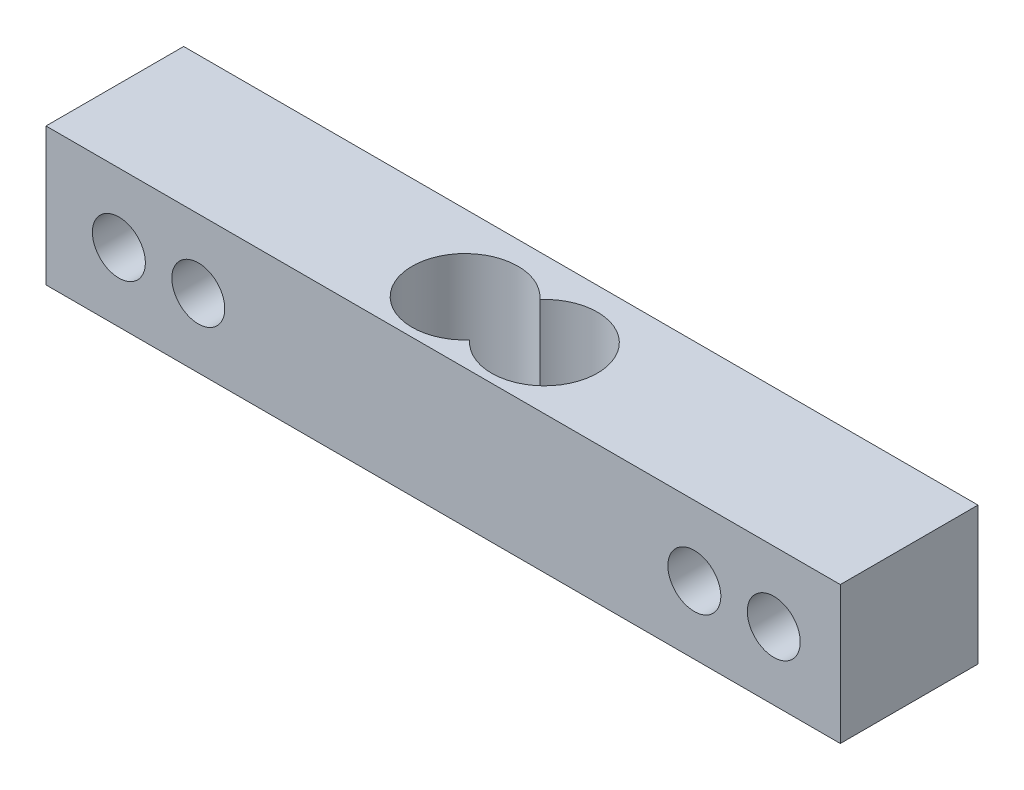
ISO-10303-21;
HEADER;
FILE_DESCRIPTION(('STEP AP214'),'2;1');
FILE_NAME('part.step','',(''),(''),'','','');
FILE_SCHEMA(('AUTOMOTIVE_DESIGN { 1 0 10303 214 1 1 1 1 }'));
ENDSEC;
DATA;
#1=APPLICATION_CONTEXT('core data for automotive mechanical design processes');
#2=APPLICATION_PROTOCOL_DEFINITION('international standard','automotive_design',2000,#1);
#3=PRODUCT_CONTEXT('',#1,'mechanical');
#4=PRODUCT('Part','Part','',(#3));
#5=PRODUCT_RELATED_PRODUCT_CATEGORY('part','',(#4));
#6=PRODUCT_DEFINITION_FORMATION('','',#4);
#7=PRODUCT_DEFINITION_CONTEXT('part definition',#1,'design');
#8=PRODUCT_DEFINITION('design','',#6,#7);
#9=PRODUCT_DEFINITION_SHAPE('','',#8);
#10=(LENGTH_UNIT() NAMED_UNIT(*) SI_UNIT(.MILLI.,.METRE.));
#11=(NAMED_UNIT(*) PLANE_ANGLE_UNIT() SI_UNIT($,.RADIAN.));
#12=(NAMED_UNIT(*) SI_UNIT($,.STERADIAN.) SOLID_ANGLE_UNIT());
#13=UNCERTAINTY_MEASURE_WITH_UNIT(LENGTH_MEASURE(1.E-05),#10,'distance_accuracy_value','');
#14=(GEOMETRIC_REPRESENTATION_CONTEXT(3) GLOBAL_UNCERTAINTY_ASSIGNED_CONTEXT((#13)) GLOBAL_UNIT_ASSIGNED_CONTEXT((#10,
#11,#12)) REPRESENTATION_CONTEXT('',''));
#15=CARTESIAN_POINT('',(0.,0.,0.));
#16=DIRECTION('',(0.,0.,1.));
#17=DIRECTION('',(1.,0.,0.));
#18=AXIS2_PLACEMENT_3D('',#15,#16,#17);
#19=CARTESIAN_POINT('',(-37.5,6.5,13.));
#20=DIRECTION('',(1.,0.,0.));
#21=DIRECTION('',(0.,0.,-1.));
#22=AXIS2_PLACEMENT_3D('',#19,#20,#21);
#23=PLANE('',#22);
#24=DIRECTION('',(0.,-1.,0.));
#25=VECTOR('',#24,1.);
#26=CARTESIAN_POINT('',(-37.5,6.5,0.));
#27=LINE('',#26,#25);
#28=CARTESIAN_POINT('',(-37.5,6.5,0.));
#29=VERTEX_POINT('',#28);
#30=CARTESIAN_POINT('',(-37.5,-6.5,0.));
#31=VERTEX_POINT('',#30);
#32=EDGE_CURVE('E110',#29,#31,#27,.T.);
#33=ORIENTED_EDGE('',*,*,#32,.T.);
#34=DIRECTION('',(0.,0.,-1.));
#35=VECTOR('',#34,1.);
#36=CARTESIAN_POINT('',(-37.5,-6.5,13.));
#37=LINE('',#36,#35);
#38=CARTESIAN_POINT('',(-37.5,-6.5,13.));
#39=VERTEX_POINT('',#38);
#40=EDGE_CURVE('E11',#39,#31,#37,.T.);
#41=ORIENTED_EDGE('',*,*,#40,.F.);
#42=DIRECTION('',(0.,-1.,0.));
#43=VECTOR('',#42,1.);
#44=CARTESIAN_POINT('',(-37.5,6.5,13.));
#45=LINE('',#44,#43);
#46=CARTESIAN_POINT('',(-37.5,6.5,13.));
#47=VERTEX_POINT('',#46);
#48=EDGE_CURVE('E127',#47,#39,#45,.T.);
#49=ORIENTED_EDGE('',*,*,#48,.F.);
#50=DIRECTION('',(0.,0.,-1.));
#51=VECTOR('',#50,1.);
#52=CARTESIAN_POINT('',(-37.5,6.5,13.));
#53=LINE('',#52,#51);
#54=EDGE_CURVE('E137',#47,#29,#53,.T.);
#55=ORIENTED_EDGE('',*,*,#54,.T.);
#56=EDGE_LOOP('',(#33,#41,#49,#55));
#57=FACE_BOUND('',#56,.T.);
#58=ADVANCED_FACE('F33',(#57),#23,.F.);
#59=CARTESIAN_POINT('',(37.5,-6.49999999999999,13.));
#60=DIRECTION('',(0.,1.,0.));
#61=DIRECTION('',(-1.,0.,0.));
#62=AXIS2_PLACEMENT_3D('',#59,#60,#61);
#63=PLANE('',#62);
#64=CARTESIAN_POINT('',(3.75,-6.5,7.18437662318027));
#65=DIRECTION('',(0.,1.,0.));
#66=DIRECTION('',(-1.,0.,0.));
#67=AXIS2_PLACEMENT_3D('',#64,#65,#66);
#68=CIRCLE('',#67,5.);
#69=CARTESIAN_POINT('',(0.,-6.5,10.491565762011));
#70=VERTEX_POINT('',#69);
#71=CARTESIAN_POINT('',(0.,-6.5,3.87718748434953));
#72=VERTEX_POINT('',#71);
#73=EDGE_CURVE('E88',#70,#72,#68,.T.);
#74=ORIENTED_EDGE('',*,*,#73,.T.);
#75=CARTESIAN_POINT('',(-3.75,-6.5,7.18437662318027));
#76=DIRECTION('',(0.,1.,0.));
#77=DIRECTION('',(-1.,0.,0.));
#78=AXIS2_PLACEMENT_3D('',#75,#76,#77);
#79=CIRCLE('',#78,5.);
#80=EDGE_CURVE('E47',#72,#70,#79,.T.);
#81=ORIENTED_EDGE('',*,*,#80,.T.);
#82=EDGE_LOOP('',(#74,#81));
#83=FACE_BOUND('',#82,.T.);
#84=DIRECTION('',(1.,0.,0.));
#85=VECTOR('',#84,1.);
#86=CARTESIAN_POINT('',(37.5,-6.49999999999999,0.));
#87=LINE('',#86,#85);
#88=CARTESIAN_POINT('',(37.5,-6.49999999999999,0.));
#89=VERTEX_POINT('',#88);
#90=EDGE_CURVE('E140',#31,#89,#87,.T.);
#91=ORIENTED_EDGE('',*,*,#90,.T.);
#92=DIRECTION('',(0.,0.,-1.));
#93=VECTOR('',#92,1.);
#94=CARTESIAN_POINT('',(37.5,-6.49999999999999,13.));
#95=LINE('',#94,#93);
#96=CARTESIAN_POINT('',(37.5,-6.49999999999999,13.));
#97=VERTEX_POINT('',#96);
#98=EDGE_CURVE('E40',#97,#89,#95,.T.);
#99=ORIENTED_EDGE('',*,*,#98,.F.);
#100=DIRECTION('',(1.,0.,0.));
#101=VECTOR('',#100,1.);
#102=CARTESIAN_POINT('',(37.5,-6.49999999999999,13.));
#103=LINE('',#102,#101);
#104=EDGE_CURVE('E130',#39,#97,#103,.T.);
#105=ORIENTED_EDGE('',*,*,#104,.F.);
#106=ORIENTED_EDGE('',*,*,#40,.T.);
#107=EDGE_LOOP('',(#91,#99,#105,#106));
#108=FACE_BOUND('',#107,.T.);
#109=ADVANCED_FACE('F94',(#83,#108),#63,.F.);
#110=CARTESIAN_POINT('',(37.5,6.50000000000001,13.));
#111=DIRECTION('',(-1.,0.,0.));
#112=DIRECTION('',(0.,0.,1.));
#113=AXIS2_PLACEMENT_3D('',#110,#111,#112);
#114=PLANE('',#113);
#115=DIRECTION('',(0.,1.,0.));
#116=VECTOR('',#115,1.);
#117=CARTESIAN_POINT('',(37.5,6.50000000000001,0.));
#118=LINE('',#117,#116);
#119=CARTESIAN_POINT('',(37.5,6.50000000000001,0.));
#120=VERTEX_POINT('',#119);
#121=EDGE_CURVE('E142',#89,#120,#118,.T.);
#122=ORIENTED_EDGE('',*,*,#121,.T.);
#123=DIRECTION('',(0.,0.,-1.));
#124=VECTOR('',#123,1.);
#125=CARTESIAN_POINT('',(37.5,6.50000000000001,13.));
#126=LINE('',#125,#124);
#127=CARTESIAN_POINT('',(37.5,6.50000000000001,13.));
#128=VERTEX_POINT('',#127);
#129=EDGE_CURVE('E147',#128,#120,#126,.T.);
#130=ORIENTED_EDGE('',*,*,#129,.F.);
#131=DIRECTION('',(0.,1.,0.));
#132=VECTOR('',#131,1.);
#133=CARTESIAN_POINT('',(37.5,6.50000000000001,13.));
#134=LINE('',#133,#132);
#135=EDGE_CURVE('E133',#97,#128,#134,.T.);
#136=ORIENTED_EDGE('',*,*,#135,.F.);
#137=ORIENTED_EDGE('',*,*,#98,.T.);
#138=EDGE_LOOP('',(#122,#130,#136,#137));
#139=FACE_BOUND('',#138,.T.);
#140=ADVANCED_FACE('F154',(#139),#114,.F.);
#141=CARTESIAN_POINT('',(37.5,6.50000000000001,13.));
#142=DIRECTION('',(0.,-1.,0.));
#143=DIRECTION('',(1.,0.,0.));
#144=AXIS2_PLACEMENT_3D('',#141,#142,#143);
#145=PLANE('',#144);
#146=CARTESIAN_POINT('',(3.75,6.5,7.18437662318027));
#147=DIRECTION('',(0.,1.,0.));
#148=DIRECTION('',(-1.,0.,0.));
#149=AXIS2_PLACEMENT_3D('',#146,#147,#148);
#150=CIRCLE('',#149,5.);
#151=CARTESIAN_POINT('',(0.,6.5,10.491565762011));
#152=VERTEX_POINT('',#151);
#153=CARTESIAN_POINT('',(0.,6.5,3.87718748434953));
#154=VERTEX_POINT('',#153);
#155=EDGE_CURVE('E96',#152,#154,#150,.T.);
#156=ORIENTED_EDGE('',*,*,#155,.F.);
#157=CARTESIAN_POINT('',(-3.75,6.5,7.18437662318027));
#158=DIRECTION('',(0.,1.,0.));
#159=DIRECTION('',(-1.,0.,0.));
#160=AXIS2_PLACEMENT_3D('',#157,#158,#159);
#161=CIRCLE('',#160,5.);
#162=EDGE_CURVE('E52',#154,#152,#161,.T.);
#163=ORIENTED_EDGE('',*,*,#162,.F.);
#164=EDGE_LOOP('',(#156,#163));
#165=FACE_BOUND('',#164,.T.);
#166=DIRECTION('',(-1.,0.,0.));
#167=VECTOR('',#166,1.);
#168=CARTESIAN_POINT('',(37.5,6.50000000000001,0.));
#169=LINE('',#168,#167);
#170=EDGE_CURVE('E131',#120,#29,#169,.T.);
#171=ORIENTED_EDGE('',*,*,#170,.T.);
#172=ORIENTED_EDGE('',*,*,#54,.F.);
#173=DIRECTION('',(-1.,0.,0.));
#174=VECTOR('',#173,1.);
#175=CARTESIAN_POINT('',(37.5,6.50000000000001,13.));
#176=LINE('',#175,#174);
#177=EDGE_CURVE('E135',#128,#47,#176,.T.);
#178=ORIENTED_EDGE('',*,*,#177,.F.);
#179=ORIENTED_EDGE('',*,*,#129,.T.);
#180=EDGE_LOOP('',(#171,#172,#178,#179));
#181=FACE_BOUND('',#180,.T.);
#182=ADVANCED_FACE('F162',(#165,#181),#145,.F.);
#183=CARTESIAN_POINT('',(0.,0.,13.));
#184=DIRECTION('',(0.,0.,-1.));
#185=DIRECTION('',(-1.,0.,0.));
#186=AXIS2_PLACEMENT_3D('',#183,#184,#185);
#187=PLANE('',#186);
#188=CARTESIAN_POINT('',(31.2163041744387,-0.0966608978927028,13.));
#189=DIRECTION('',(0.,0.,-1.));
#190=DIRECTION('',(-1.,0.,0.));
#191=AXIS2_PLACEMENT_3D('',#188,#189,#190);
#192=CIRCLE('',#191,2.5);
#193=CARTESIAN_POINT('',(28.7163041744387,-0.0966608978927028,13.));
#194=VERTEX_POINT('',#193);
#195=EDGE_CURVE('E106',#194,#194,#192,.T.);
#196=ORIENTED_EDGE('',*,*,#195,.T.);
#197=EDGE_LOOP('',(#196));
#198=FACE_BOUND('',#197,.T.);
#199=CARTESIAN_POINT('',(23.7163041744387,-0.0966608978927028,13.));
#200=DIRECTION('',(0.,0.,-1.));
#201=DIRECTION('',(-1.,0.,0.));
#202=AXIS2_PLACEMENT_3D('',#199,#200,#201);
#203=CIRCLE('',#202,2.5);
#204=CARTESIAN_POINT('',(21.2163041744387,-0.0966608978927028,13.));
#205=VERTEX_POINT('',#204);
#206=EDGE_CURVE('E107',#205,#205,#203,.T.);
#207=ORIENTED_EDGE('',*,*,#206,.T.);
#208=EDGE_LOOP('',(#207));
#209=FACE_BOUND('',#208,.T.);
#210=CARTESIAN_POINT('',(-23.1191385035794,0.000687162781239995,13.));
#211=DIRECTION('',(0.,0.,-1.));
#212=DIRECTION('',(-1.,0.,0.));
#213=AXIS2_PLACEMENT_3D('',#210,#211,#212);
#214=CIRCLE('',#213,2.5);
#215=CARTESIAN_POINT('',(-25.6191385035794,0.000687162781239995,13.));
#216=VERTEX_POINT('',#215);
#217=EDGE_CURVE('E114',#216,#216,#214,.T.);
#218=ORIENTED_EDGE('',*,*,#217,.T.);
#219=EDGE_LOOP('',(#218));
#220=FACE_BOUND('',#219,.T.);
#221=CARTESIAN_POINT('',(-30.6191385035794,0.00068716278123996,13.));
#222=DIRECTION('',(0.,0.,-1.));
#223=DIRECTION('',(-1.,0.,0.));
#224=AXIS2_PLACEMENT_3D('',#221,#222,#223);
#225=CIRCLE('',#224,2.5);
#226=CARTESIAN_POINT('',(-33.1191385035794,0.00068716278123996,13.));
#227=VERTEX_POINT('',#226);
#228=EDGE_CURVE('E120',#227,#227,#225,.T.);
#229=ORIENTED_EDGE('',*,*,#228,.T.);
#230=EDGE_LOOP('',(#229));
#231=FACE_BOUND('',#230,.T.);
#232=ORIENTED_EDGE('',*,*,#48,.T.);
#233=ORIENTED_EDGE('',*,*,#104,.T.);
#234=ORIENTED_EDGE('',*,*,#135,.T.);
#235=ORIENTED_EDGE('',*,*,#177,.T.);
#236=EDGE_LOOP('',(#232,#233,#234,#235));
#237=FACE_BOUND('',#236,.T.);
#238=ADVANCED_FACE('F168',(#198,#209,#220,#231,#237),#187,.F.);
#239=CARTESIAN_POINT('',(0.,0.,0.));
#240=DIRECTION('',(0.,0.,-1.));
#241=DIRECTION('',(-1.,0.,0.));
#242=AXIS2_PLACEMENT_3D('',#239,#240,#241);
#243=PLANE('',#242);
#244=CARTESIAN_POINT('',(31.2163041744387,-0.0966608978927028,0.));
#245=DIRECTION('',(0.,0.,1.));
#246=DIRECTION('',(1.,0.,0.));
#247=AXIS2_PLACEMENT_3D('',#244,#245,#246);
#248=CIRCLE('',#247,2.5);
#249=CARTESIAN_POINT('',(33.7163041744388,-0.0966608978927028,0.));
#250=VERTEX_POINT('',#249);
#251=EDGE_CURVE('E103',#250,#250,#248,.T.);
#252=ORIENTED_EDGE('',*,*,#251,.T.);
#253=EDGE_LOOP('',(#252));
#254=FACE_BOUND('',#253,.T.);
#255=CARTESIAN_POINT('',(23.7163041744387,-0.0966608978927028,0.));
#256=DIRECTION('',(0.,0.,1.));
#257=DIRECTION('',(1.,0.,0.));
#258=AXIS2_PLACEMENT_3D('',#255,#256,#257);
#259=CIRCLE('',#258,2.5);
#260=CARTESIAN_POINT('',(26.2163041744388,-0.0966608978927028,0.));
#261=VERTEX_POINT('',#260);
#262=EDGE_CURVE('E111',#261,#261,#259,.T.);
#263=ORIENTED_EDGE('',*,*,#262,.T.);
#264=EDGE_LOOP('',(#263));
#265=FACE_BOUND('',#264,.T.);
#266=CARTESIAN_POINT('',(-23.1191385035794,0.000687162781239995,0.));
#267=DIRECTION('',(0.,0.,1.));
#268=DIRECTION('',(1.,0.,0.));
#269=AXIS2_PLACEMENT_3D('',#266,#267,#268);
#270=CIRCLE('',#269,2.5);
#271=CARTESIAN_POINT('',(-20.6191385035794,0.000687162781239995,0.));
#272=VERTEX_POINT('',#271);
#273=EDGE_CURVE('E117',#272,#272,#270,.T.);
#274=ORIENTED_EDGE('',*,*,#273,.T.);
#275=EDGE_LOOP('',(#274));
#276=FACE_BOUND('',#275,.T.);
#277=CARTESIAN_POINT('',(-30.6191385035794,0.00068716278123996,0.));
#278=DIRECTION('',(0.,0.,1.));
#279=DIRECTION('',(1.,0.,0.));
#280=AXIS2_PLACEMENT_3D('',#277,#278,#279);
#281=CIRCLE('',#280,2.5);
#282=CARTESIAN_POINT('',(-28.1191385035794,0.00068716278123996,0.));
#283=VERTEX_POINT('',#282);
#284=EDGE_CURVE('E101',#283,#283,#281,.T.);
#285=ORIENTED_EDGE('',*,*,#284,.T.);
#286=EDGE_LOOP('',(#285));
#287=FACE_BOUND('',#286,.T.);
#288=ORIENTED_EDGE('',*,*,#32,.F.);
#289=ORIENTED_EDGE('',*,*,#170,.F.);
#290=ORIENTED_EDGE('',*,*,#121,.F.);
#291=ORIENTED_EDGE('',*,*,#90,.F.);
#292=EDGE_LOOP('',(#288,#289,#290,#291));
#293=FACE_BOUND('',#292,.T.);
#294=ADVANCED_FACE('F159',(#254,#265,#276,#287,#293),#243,.T.);
#295=CARTESIAN_POINT('',(-30.6191385035794,0.00068716278123996,20.0710678118655));
#296=DIRECTION('',(0.,0.,-1.));
#297=DIRECTION('',(-1.,0.,0.));
#298=AXIS2_PLACEMENT_3D('',#295,#296,#297);
#299=CYLINDRICAL_SURFACE('',#298,2.5);
#300=ORIENTED_EDGE('',*,*,#228,.F.);
#301=EDGE_LOOP('',(#300));
#302=FACE_BOUND('',#301,.T.);
#303=ORIENTED_EDGE('',*,*,#284,.F.);
#304=EDGE_LOOP('',(#303));
#305=FACE_BOUND('',#304,.T.);
#306=ADVANCED_FACE('F181',(#302,#305),#299,.F.);
#307=CARTESIAN_POINT('',(-23.1191385035794,0.000687162781239995,20.0710678118655));
#308=DIRECTION('',(0.,0.,-1.));
#309=DIRECTION('',(-1.,0.,0.));
#310=AXIS2_PLACEMENT_3D('',#307,#308,#309);
#311=CYLINDRICAL_SURFACE('',#310,2.5);
#312=ORIENTED_EDGE('',*,*,#217,.F.);
#313=EDGE_LOOP('',(#312));
#314=FACE_BOUND('',#313,.T.);
#315=ORIENTED_EDGE('',*,*,#273,.F.);
#316=EDGE_LOOP('',(#315));
#317=FACE_BOUND('',#316,.T.);
#318=ADVANCED_FACE('F188',(#314,#317),#311,.F.);
#319=CARTESIAN_POINT('',(23.7163041744387,-0.0966608978927028,20.0710678118655));
#320=DIRECTION('',(0.,0.,-1.));
#321=DIRECTION('',(-1.,0.,0.));
#322=AXIS2_PLACEMENT_3D('',#319,#320,#321);
#323=CYLINDRICAL_SURFACE('',#322,2.5);
#324=ORIENTED_EDGE('',*,*,#206,.F.);
#325=EDGE_LOOP('',(#324));
#326=FACE_BOUND('',#325,.T.);
#327=ORIENTED_EDGE('',*,*,#262,.F.);
#328=EDGE_LOOP('',(#327));
#329=FACE_BOUND('',#328,.T.);
#330=ADVANCED_FACE('F192',(#326,#329),#323,.F.);
#331=CARTESIAN_POINT('',(31.2163041744387,-0.0966608978927028,20.0710678118655));
#332=DIRECTION('',(0.,0.,-1.));
#333=DIRECTION('',(-1.,0.,0.));
#334=AXIS2_PLACEMENT_3D('',#331,#332,#333);
#335=CYLINDRICAL_SURFACE('',#334,2.5);
#336=ORIENTED_EDGE('',*,*,#195,.F.);
#337=EDGE_LOOP('',(#336));
#338=FACE_BOUND('',#337,.T.);
#339=ORIENTED_EDGE('',*,*,#251,.F.);
#340=EDGE_LOOP('',(#339));
#341=FACE_BOUND('',#340,.T.);
#342=ADVANCED_FACE('F196',(#338,#341),#335,.F.);
#343=CARTESIAN_POINT('',(-3.75,-6.5,7.18437662318027));
#344=DIRECTION('',(0.,1.,0.));
#345=DIRECTION('',(-1.,0.,0.));
#346=AXIS2_PLACEMENT_3D('',#343,#344,#345);
#347=CYLINDRICAL_SURFACE('',#346,5.);
#348=ORIENTED_EDGE('',*,*,#162,.T.);
#349=DIRECTION('',(0.,1.,0.));
#350=VECTOR('',#349,1.);
#351=CARTESIAN_POINT('',(0.,-6.5,10.491565762011));
#352=LINE('',#351,#350);
#353=EDGE_CURVE('E81',#70,#152,#352,.T.);
#354=ORIENTED_EDGE('',*,*,#353,.F.);
#355=ORIENTED_EDGE('',*,*,#80,.F.);
#356=DIRECTION('',(0.,1.,0.));
#357=VECTOR('',#356,1.);
#358=CARTESIAN_POINT('',(0.,-6.5,3.87718748434953));
#359=LINE('',#358,#357);
#360=EDGE_CURVE('E87',#72,#154,#359,.T.);
#361=ORIENTED_EDGE('',*,*,#360,.T.);
#362=EDGE_LOOP('',(#348,#354,#355,#361));
#363=FACE_BOUND('',#362,.T.);
#364=ADVANCED_FACE('F83',(#363),#347,.F.);
#365=CARTESIAN_POINT('',(3.75,-6.5,7.18437662318027));
#366=DIRECTION('',(0.,1.,0.));
#367=DIRECTION('',(-1.,0.,0.));
#368=AXIS2_PLACEMENT_3D('',#365,#366,#367);
#369=CYLINDRICAL_SURFACE('',#368,5.);
#370=ORIENTED_EDGE('',*,*,#155,.T.);
#371=ORIENTED_EDGE('',*,*,#360,.F.);
#372=ORIENTED_EDGE('',*,*,#73,.F.);
#373=ORIENTED_EDGE('',*,*,#353,.T.);
#374=EDGE_LOOP('',(#370,#371,#372,#373));
#375=FACE_BOUND('',#374,.T.);
#376=ADVANCED_FACE('F91',(#375),#369,.F.);
#377=CLOSED_SHELL('',(#58,#109,#140,#182,#238,#294,#306,#318,#330,#342,#364,#376));
#378=MANIFOLD_SOLID_BREP('B2',#377);
#379=ADVANCED_BREP_SHAPE_REPRESENTATION('',(#18,#378),#14);
#380=SHAPE_DEFINITION_REPRESENTATION(#9,#379);
ENDSEC;
END-ISO-10303-21;
